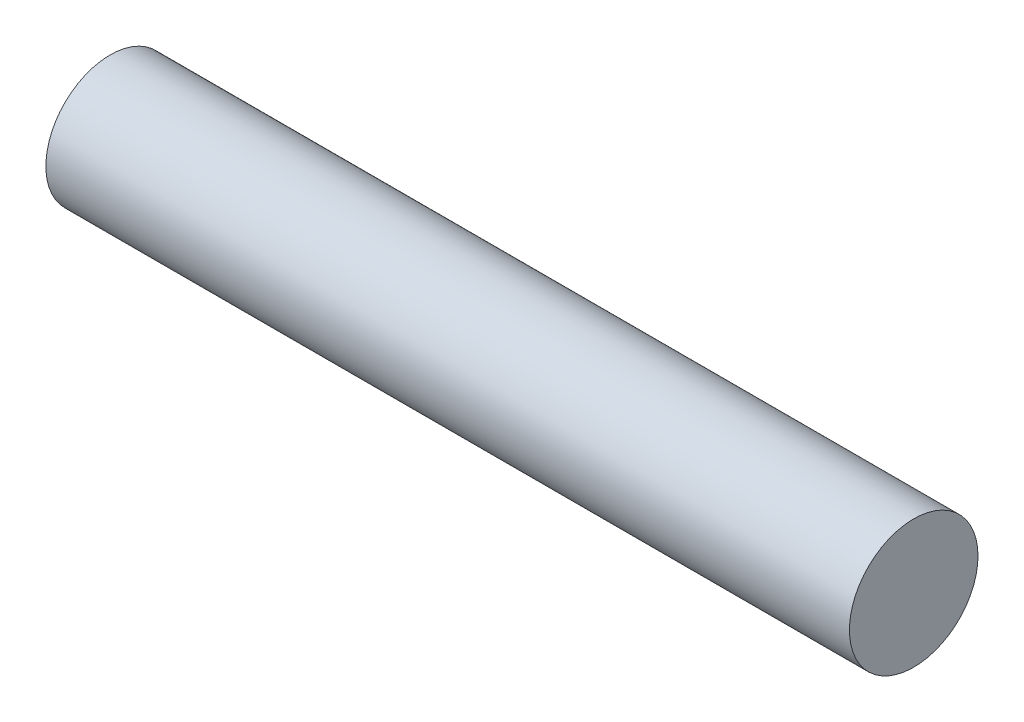
ISO-10303-21;
HEADER;
FILE_DESCRIPTION(('STEP AP214'),'2;1');
FILE_NAME('part.step','',(''),(''),'','','');
FILE_SCHEMA(('AUTOMOTIVE_DESIGN { 1 0 10303 214 1 1 1 1 }'));
ENDSEC;
DATA;
#1=APPLICATION_CONTEXT('core data for automotive mechanical design processes');
#2=APPLICATION_PROTOCOL_DEFINITION('international standard','automotive_design',2000,#1);
#3=PRODUCT_CONTEXT('',#1,'mechanical');
#4=PRODUCT('Part','Part','',(#3));
#5=PRODUCT_RELATED_PRODUCT_CATEGORY('part','',(#4));
#6=PRODUCT_DEFINITION_FORMATION('','',#4);
#7=PRODUCT_DEFINITION_CONTEXT('part definition',#1,'design');
#8=PRODUCT_DEFINITION('design','',#6,#7);
#9=PRODUCT_DEFINITION_SHAPE('','',#8);
#10=(LENGTH_UNIT() NAMED_UNIT(*) SI_UNIT(.MILLI.,.METRE.));
#11=(NAMED_UNIT(*) PLANE_ANGLE_UNIT() SI_UNIT($,.RADIAN.));
#12=(NAMED_UNIT(*) SI_UNIT($,.STERADIAN.) SOLID_ANGLE_UNIT());
#13=UNCERTAINTY_MEASURE_WITH_UNIT(LENGTH_MEASURE(1.E-05),#10,'distance_accuracy_value','');
#14=(GEOMETRIC_REPRESENTATION_CONTEXT(3) GLOBAL_UNCERTAINTY_ASSIGNED_CONTEXT((#13)) GLOBAL_UNIT_ASSIGNED_CONTEXT((#10,
#11,#12)) REPRESENTATION_CONTEXT('',''));
#15=CARTESIAN_POINT('',(0.,0.,0.));
#16=DIRECTION('',(0.,0.,1.));
#17=DIRECTION('',(1.,0.,0.));
#18=AXIS2_PLACEMENT_3D('',#15,#16,#17);
#19=CARTESIAN_POINT('',(-251.,30.,16.));
#20=DIRECTION('',(1.,0.,0.));
#21=DIRECTION('',(0.,0.,-1.));
#22=AXIS2_PLACEMENT_3D('',#19,#20,#21);
#23=PLANE('',#22);
#24=DIRECTION('',(0.,0.,1.));
#25=VECTOR('',#24,1.);
#26=CARTESIAN_POINT('',(-251.,13.,16.));
#27=LINE('',#26,#25);
#28=CARTESIAN_POINT('',(-251.,13.,-16.));
#29=VERTEX_POINT('',#28);
#30=CARTESIAN_POINT('',(-251.,13.,16.));
#31=VERTEX_POINT('',#30);
#32=EDGE_CURVE('E119',#29,#31,#27,.T.);
#33=ORIENTED_EDGE('',*,*,#32,.T.);
#34=DIRECTION('',(0.,-1.,0.));
#35=VECTOR('',#34,1.);
#36=CARTESIAN_POINT('',(-251.,30.,16.));
#37=LINE('',#36,#35);
#38=CARTESIAN_POINT('',(-251.,30.,16.));
#39=VERTEX_POINT('',#38);
#40=EDGE_CURVE('E12',#39,#31,#37,.T.);
#41=ORIENTED_EDGE('',*,*,#40,.F.);
#42=DIRECTION('',(0.,0.,1.));
#43=VECTOR('',#42,1.);
#44=CARTESIAN_POINT('',(-251.,30.,16.));
#45=LINE('',#44,#43);
#46=CARTESIAN_POINT('',(-251.,30.,-16.));
#47=VERTEX_POINT('',#46);
#48=EDGE_CURVE('E107',#47,#39,#45,.T.);
#49=ORIENTED_EDGE('',*,*,#48,.F.);
#50=DIRECTION('',(0.,-1.,0.));
#51=VECTOR('',#50,1.);
#52=CARTESIAN_POINT('',(-251.,30.,-16.));
#53=LINE('',#52,#51);
#54=EDGE_CURVE('E115',#47,#29,#53,.T.);
#55=ORIENTED_EDGE('',*,*,#54,.T.);
#56=EDGE_LOOP('',(#33,#41,#49,#55));
#57=FACE_BOUND('',#56,.T.);
#58=ADVANCED_FACE('F56',(#57),#23,.F.);
#59=CARTESIAN_POINT('',(-251.,30.,16.));
#60=DIRECTION('',(0.,0.,-1.));
#61=DIRECTION('',(-1.,0.,0.));
#62=AXIS2_PLACEMENT_3D('',#59,#60,#61);
#63=PLANE('',#62);
#64=DIRECTION('',(1.,0.,0.));
#65=VECTOR('',#64,1.);
#66=CARTESIAN_POINT('',(-251.,13.,16.));
#67=LINE('',#66,#65);
#68=CARTESIAN_POINT('',(-199.,13.,16.));
#69=VERTEX_POINT('',#68);
#70=EDGE_CURVE('E111',#31,#69,#67,.T.);
#71=ORIENTED_EDGE('',*,*,#70,.T.);
#72=DIRECTION('',(0.,-1.,0.));
#73=VECTOR('',#72,1.);
#74=CARTESIAN_POINT('',(-199.,30.,16.));
#75=LINE('',#74,#73);
#76=CARTESIAN_POINT('',(-199.,30.,16.));
#77=VERTEX_POINT('',#76);
#78=EDGE_CURVE('E64',#77,#69,#75,.T.);
#79=ORIENTED_EDGE('',*,*,#78,.F.);
#80=DIRECTION('',(1.,0.,0.));
#81=VECTOR('',#80,1.);
#82=CARTESIAN_POINT('',(-251.,30.,16.));
#83=LINE('',#82,#81);
#84=EDGE_CURVE('E102',#39,#77,#83,.T.);
#85=ORIENTED_EDGE('',*,*,#84,.F.);
#86=ORIENTED_EDGE('',*,*,#40,.T.);
#87=EDGE_LOOP('',(#71,#79,#85,#86));
#88=FACE_BOUND('',#87,.T.);
#89=ADVANCED_FACE('F110',(#88),#63,.F.);
#90=CARTESIAN_POINT('',(-199.,30.,16.));
#91=DIRECTION('',(-1.,0.,0.));
#92=DIRECTION('',(0.,0.,1.));
#93=AXIS2_PLACEMENT_3D('',#90,#91,#92);
#94=PLANE('',#93);
#95=DIRECTION('',(0.,0.,-1.));
#96=VECTOR('',#95,1.);
#97=CARTESIAN_POINT('',(-199.,13.,16.));
#98=LINE('',#97,#96);
#99=CARTESIAN_POINT('',(-199.,13.,-16.));
#100=VERTEX_POINT('',#99);
#101=EDGE_CURVE('E89',#69,#100,#98,.T.);
#102=ORIENTED_EDGE('',*,*,#101,.T.);
#103=DIRECTION('',(0.,-1.,0.));
#104=VECTOR('',#103,1.);
#105=CARTESIAN_POINT('',(-199.,30.,-16.));
#106=LINE('',#105,#104);
#107=CARTESIAN_POINT('',(-199.,30.,-16.));
#108=VERTEX_POINT('',#107);
#109=EDGE_CURVE('E112',#108,#100,#106,.T.);
#110=ORIENTED_EDGE('',*,*,#109,.F.);
#111=DIRECTION('',(0.,0.,-1.));
#112=VECTOR('',#111,1.);
#113=CARTESIAN_POINT('',(-199.,30.,16.));
#114=LINE('',#113,#112);
#115=EDGE_CURVE('E105',#77,#108,#114,.T.);
#116=ORIENTED_EDGE('',*,*,#115,.F.);
#117=ORIENTED_EDGE('',*,*,#78,.T.);
#118=EDGE_LOOP('',(#102,#110,#116,#117));
#119=FACE_BOUND('',#118,.T.);
#120=ADVANCED_FACE('F113',(#119),#94,.F.);
#121=CARTESIAN_POINT('',(-251.,30.,-16.));
#122=DIRECTION('',(0.,0.,1.));
#123=DIRECTION('',(1.,0.,0.));
#124=AXIS2_PLACEMENT_3D('',#121,#122,#123);
#125=PLANE('',#124);
#126=DIRECTION('',(-1.,0.,0.));
#127=VECTOR('',#126,1.);
#128=CARTESIAN_POINT('',(-251.,13.,-16.));
#129=LINE('',#128,#127);
#130=EDGE_CURVE('E95',#100,#29,#129,.T.);
#131=ORIENTED_EDGE('',*,*,#130,.T.);
#132=ORIENTED_EDGE('',*,*,#54,.F.);
#133=DIRECTION('',(-1.,0.,0.));
#134=VECTOR('',#133,1.);
#135=CARTESIAN_POINT('',(-251.,30.,-16.));
#136=LINE('',#135,#134);
#137=EDGE_CURVE('E72',#108,#47,#136,.T.);
#138=ORIENTED_EDGE('',*,*,#137,.F.);
#139=ORIENTED_EDGE('',*,*,#109,.T.);
#140=EDGE_LOOP('',(#131,#132,#138,#139));
#141=FACE_BOUND('',#140,.T.);
#142=ADVANCED_FACE('F126',(#141),#125,.F.);
#143=CARTESIAN_POINT('',(0.,30.,0.));
#144=DIRECTION('',(0.,-1.,0.));
#145=DIRECTION('',(0.,0.,-1.));
#146=AXIS2_PLACEMENT_3D('',#143,#144,#145);
#147=PLANE('',#146);
#148=ORIENTED_EDGE('',*,*,#48,.T.);
#149=ORIENTED_EDGE('',*,*,#84,.T.);
#150=ORIENTED_EDGE('',*,*,#115,.T.);
#151=ORIENTED_EDGE('',*,*,#137,.T.);
#152=EDGE_LOOP('',(#148,#149,#150,#151));
#153=FACE_BOUND('',#152,.T.);
#154=ADVANCED_FACE('F103',(#153),#147,.F.);
#155=CARTESIAN_POINT('',(0.,13.,0.));
#156=DIRECTION('',(0.,-1.,0.));
#157=DIRECTION('',(0.,0.,-1.));
#158=AXIS2_PLACEMENT_3D('',#155,#156,#157);
#159=PLANE('',#158);
#160=ORIENTED_EDGE('',*,*,#32,.F.);
#161=ORIENTED_EDGE('',*,*,#130,.F.);
#162=ORIENTED_EDGE('',*,*,#101,.F.);
#163=ORIENTED_EDGE('',*,*,#70,.F.);
#164=EDGE_LOOP('',(#160,#161,#162,#163));
#165=FACE_BOUND('',#164,.T.);
#166=ADVANCED_FACE('F129',(#165),#159,.T.);
#167=CLOSED_SHELL('',(#58,#89,#120,#142,#154,#166));
#168=MANIFOLD_SOLID_BREP('B2',#167);
#169=CARTESIAN_POINT('',(-422.5,-47.,24.));
#170=DIRECTION('',(-1.,0.,0.));
#171=DIRECTION('',(0.,0.,1.));
#172=AXIS2_PLACEMENT_3D('',#169,#170,#171);
#173=PLANE('',#172);
#174=DIRECTION('',(0.,1.,0.));
#175=VECTOR('',#174,1.);
#176=CARTESIAN_POINT('',(-422.5,-47.,24.));
#177=LINE('',#176,#175);
#178=CARTESIAN_POINT('',(-422.5,-47.,24.));
#179=VERTEX_POINT('',#178);
#180=CARTESIAN_POINT('',(-422.5,3.,24.));
#181=VERTEX_POINT('',#180);
#182=EDGE_CURVE('E197',#179,#181,#177,.T.);
#183=ORIENTED_EDGE('',*,*,#182,.T.);
#184=DIRECTION('',(0.,0.,1.));
#185=VECTOR('',#184,1.);
#186=CARTESIAN_POINT('',(-422.5,3.,24.));
#187=LINE('',#186,#185);
#188=CARTESIAN_POINT('',(-422.5,3.,-24.));
#189=VERTEX_POINT('',#188);
#190=EDGE_CURVE('E234',#189,#181,#187,.T.);
#191=ORIENTED_EDGE('',*,*,#190,.F.);
#192=DIRECTION('',(0.,1.,0.));
#193=VECTOR('',#192,1.);
#194=CARTESIAN_POINT('',(-422.5,-47.,-24.));
#195=LINE('',#194,#193);
#196=CARTESIAN_POINT('',(-422.5,-47.,-24.));
#197=VERTEX_POINT('',#196);
#198=EDGE_CURVE('E54',#197,#189,#195,.T.);
#199=ORIENTED_EDGE('',*,*,#198,.F.);
#200=DIRECTION('',(0.,0.,1.));
#201=VECTOR('',#200,1.);
#202=CARTESIAN_POINT('',(-422.5,-47.,24.));
#203=LINE('',#202,#201);
#204=EDGE_CURVE('E235',#197,#179,#203,.T.);
#205=ORIENTED_EDGE('',*,*,#204,.T.);
#206=EDGE_LOOP('',(#183,#191,#199,#205));
#207=FACE_BOUND('',#206,.T.);
#208=ADVANCED_FACE('F194',(#207),#173,.T.);
#209=CARTESIAN_POINT('',(-422.5,-47.,-24.));
#210=DIRECTION('',(0.,0.,-1.));
#211=DIRECTION('',(-1.,0.,0.));
#212=AXIS2_PLACEMENT_3D('',#209,#210,#211);
#213=PLANE('',#212);
#214=ORIENTED_EDGE('',*,*,#198,.T.);
#215=DIRECTION('',(-1.,0.,0.));
#216=VECTOR('',#215,1.);
#217=CARTESIAN_POINT('',(-422.5,3.,-24.));
#218=LINE('',#217,#216);
#219=CARTESIAN_POINT('',(-267.5,3.,-24.));
#220=VERTEX_POINT('',#219);
#221=EDGE_CURVE('E251',#220,#189,#218,.T.);
#222=ORIENTED_EDGE('',*,*,#221,.F.);
#223=DIRECTION('',(0.,1.,0.));
#224=VECTOR('',#223,1.);
#225=CARTESIAN_POINT('',(-267.5,-47.,-24.));
#226=LINE('',#225,#224);
#227=CARTESIAN_POINT('',(-267.5,-47.,-24.));
#228=VERTEX_POINT('',#227);
#229=EDGE_CURVE('E202',#228,#220,#226,.T.);
#230=ORIENTED_EDGE('',*,*,#229,.F.);
#231=DIRECTION('',(-1.,0.,0.));
#232=VECTOR('',#231,1.);
#233=CARTESIAN_POINT('',(-422.5,-47.,-24.));
#234=LINE('',#233,#232);
#235=EDGE_CURVE('E240',#228,#197,#234,.T.);
#236=ORIENTED_EDGE('',*,*,#235,.T.);
#237=EDGE_LOOP('',(#214,#222,#230,#236));
#238=FACE_BOUND('',#237,.T.);
#239=ADVANCED_FACE('F266',(#238),#213,.T.);
#240=CARTESIAN_POINT('',(-267.5,-47.,24.));
#241=DIRECTION('',(1.,0.,0.));
#242=DIRECTION('',(0.,0.,-1.));
#243=AXIS2_PLACEMENT_3D('',#240,#241,#242);
#244=PLANE('',#243);
#245=ORIENTED_EDGE('',*,*,#229,.T.);
#246=DIRECTION('',(0.,0.,-1.));
#247=VECTOR('',#246,1.);
#248=CARTESIAN_POINT('',(-267.5,3.,24.));
#249=LINE('',#248,#247);
#250=CARTESIAN_POINT('',(-267.5,3.,24.));
#251=VERTEX_POINT('',#250);
#252=EDGE_CURVE('E247',#251,#220,#249,.T.);
#253=ORIENTED_EDGE('',*,*,#252,.F.);
#254=DIRECTION('',(0.,1.,0.));
#255=VECTOR('',#254,1.);
#256=CARTESIAN_POINT('',(-267.5,-47.,24.));
#257=LINE('',#256,#255);
#258=CARTESIAN_POINT('',(-267.5,-47.,24.));
#259=VERTEX_POINT('',#258);
#260=EDGE_CURVE('E239',#259,#251,#257,.T.);
#261=ORIENTED_EDGE('',*,*,#260,.F.);
#262=DIRECTION('',(0.,0.,-1.));
#263=VECTOR('',#262,1.);
#264=CARTESIAN_POINT('',(-267.5,-47.,24.));
#265=LINE('',#264,#263);
#266=EDGE_CURVE('E259',#259,#228,#265,.T.);
#267=ORIENTED_EDGE('',*,*,#266,.T.);
#268=EDGE_LOOP('',(#245,#253,#261,#267));
#269=FACE_BOUND('',#268,.T.);
#270=ADVANCED_FACE('F263',(#269),#244,.T.);
#271=CARTESIAN_POINT('',(-422.5,-47.,24.));
#272=DIRECTION('',(0.,0.,1.));
#273=DIRECTION('',(1.,0.,0.));
#274=AXIS2_PLACEMENT_3D('',#271,#272,#273);
#275=PLANE('',#274);
#276=ORIENTED_EDGE('',*,*,#260,.T.);
#277=DIRECTION('',(1.,0.,0.));
#278=VECTOR('',#277,1.);
#279=CARTESIAN_POINT('',(-422.5,3.,24.));
#280=LINE('',#279,#278);
#281=EDGE_CURVE('E242',#181,#251,#280,.T.);
#282=ORIENTED_EDGE('',*,*,#281,.F.);
#283=ORIENTED_EDGE('',*,*,#182,.F.);
#284=DIRECTION('',(1.,0.,0.));
#285=VECTOR('',#284,1.);
#286=CARTESIAN_POINT('',(-422.5,-47.,24.));
#287=LINE('',#286,#285);
#288=EDGE_CURVE('E257',#179,#259,#287,.T.);
#289=ORIENTED_EDGE('',*,*,#288,.T.);
#290=EDGE_LOOP('',(#276,#282,#283,#289));
#291=FACE_BOUND('',#290,.T.);
#292=ADVANCED_FACE('F243',(#291),#275,.T.);
#293=CARTESIAN_POINT('',(0.,-47.,0.));
#294=DIRECTION('',(0.,-1.,0.));
#295=DIRECTION('',(0.,0.,-1.));
#296=AXIS2_PLACEMENT_3D('',#293,#294,#295);
#297=PLANE('',#296);
#298=ORIENTED_EDGE('',*,*,#204,.F.);
#299=ORIENTED_EDGE('',*,*,#235,.F.);
#300=ORIENTED_EDGE('',*,*,#266,.F.);
#301=ORIENTED_EDGE('',*,*,#288,.F.);
#302=EDGE_LOOP('',(#298,#299,#300,#301));
#303=FACE_BOUND('',#302,.T.);
#304=ADVANCED_FACE('F268',(#303),#297,.T.);
#305=CARTESIAN_POINT('',(0.,3.,0.));
#306=DIRECTION('',(0.,-1.,0.));
#307=DIRECTION('',(0.,0.,-1.));
#308=AXIS2_PLACEMENT_3D('',#305,#306,#307);
#309=PLANE('',#308);
#310=ORIENTED_EDGE('',*,*,#190,.T.);
#311=ORIENTED_EDGE('',*,*,#281,.T.);
#312=ORIENTED_EDGE('',*,*,#252,.T.);
#313=ORIENTED_EDGE('',*,*,#221,.T.);
#314=EDGE_LOOP('',(#310,#311,#312,#313));
#315=FACE_BOUND('',#314,.T.);
#316=ADVANCED_FACE('F250',(#315),#309,.F.);
#317=CLOSED_SHELL('',(#208,#239,#270,#292,#304,#316));
#318=MANIFOLD_SOLID_BREP('B6',#317);
#319=CARTESIAN_POINT('',(-1000.,0.,0.));
#320=DIRECTION('',(1.,0.,0.));
#321=DIRECTION('',(0.,0.,-1.));
#322=AXIS2_PLACEMENT_3D('',#319,#320,#321);
#323=CYLINDRICAL_SURFACE('',#322,80.);
#324=CARTESIAN_POINT('',(-1000.,0.,0.));
#325=DIRECTION('',(1.,0.,0.));
#326=DIRECTION('',(0.,0.,-1.));
#327=AXIS2_PLACEMENT_3D('',#324,#325,#326);
#328=CIRCLE('',#327,80.);
#329=CARTESIAN_POINT('',(-1000.,0.,-80.));
#330=VERTEX_POINT('',#329);
#331=EDGE_CURVE('E332',#330,#330,#328,.T.);
#332=ORIENTED_EDGE('',*,*,#331,.T.);
#333=EDGE_LOOP('',(#332));
#334=FACE_BOUND('',#333,.T.);
#335=CARTESIAN_POINT('',(0.,0.,0.));
#336=DIRECTION('',(1.,0.,0.));
#337=DIRECTION('',(0.,0.,-1.));
#338=AXIS2_PLACEMENT_3D('',#335,#336,#337);
#339=CIRCLE('',#338,80.);
#340=CARTESIAN_POINT('',(0.,0.,-80.));
#341=VERTEX_POINT('',#340);
#342=EDGE_CURVE('E327',#341,#341,#339,.T.);
#343=ORIENTED_EDGE('',*,*,#342,.F.);
#344=EDGE_LOOP('',(#343));
#345=FACE_BOUND('',#344,.T.);
#346=ADVANCED_FACE('F324',(#334,#345),#323,.T.);
#347=CARTESIAN_POINT('',(-1000.,0.,0.));
#348=DIRECTION('',(1.,0.,0.));
#349=DIRECTION('',(0.,0.,-1.));
#350=AXIS2_PLACEMENT_3D('',#347,#348,#349);
#351=PLANE('',#350);
#352=ORIENTED_EDGE('',*,*,#331,.F.);
#353=EDGE_LOOP('',(#352));
#354=FACE_BOUND('',#353,.T.);
#355=ADVANCED_FACE('F472',(#354),#351,.F.);
#356=CARTESIAN_POINT('',(0.,0.,0.));
#357=DIRECTION('',(1.,0.,0.));
#358=DIRECTION('',(0.,0.,-1.));
#359=AXIS2_PLACEMENT_3D('',#356,#357,#358);
#360=PLANE('',#359);
#361=ORIENTED_EDGE('',*,*,#342,.T.);
#362=EDGE_LOOP('',(#361));
#363=FACE_BOUND('',#362,.T.);
#364=ADVANCED_FACE('F469',(#363),#360,.T.);
#365=CLOSED_SHELL('',(#346,#355,#364));
#366=CARTESIAN_POINT('',(0.,9.99999999999999,0.));
#367=DIRECTION('',(0.,-1.,0.));
#368=DIRECTION('',(0.,0.,-1.));
#369=AXIS2_PLACEMENT_3D('',#366,#367,#368);
#370=PLANE('',#369);
#371=DIRECTION('',(-1.,0.,0.));
#372=VECTOR('',#371,1.);
#373=CARTESIAN_POINT('',(-427.5,9.99999999999999,-30.));
#374=LINE('',#373,#372);
#375=CARTESIAN_POINT('',(-300.,10.,-30.));
#376=VERTEX_POINT('',#375);
#377=CARTESIAN_POINT('',(-427.5,9.99999999999999,-30.));
#378=VERTEX_POINT('',#377);
#379=EDGE_CURVE('E364',#376,#378,#374,.T.);
#380=ORIENTED_EDGE('',*,*,#379,.F.);
#381=DIRECTION('',(0.,0.,1.));
#382=VECTOR('',#381,1.);
#383=CARTESIAN_POINT('',(-300.,10.,40.));
#384=LINE('',#383,#382);
#385=CARTESIAN_POINT('',(-300.,9.99999999999999,30.));
#386=VERTEX_POINT('',#385);
#387=EDGE_CURVE('E192',#376,#386,#384,.T.);
#388=ORIENTED_EDGE('',*,*,#387,.T.);
#389=DIRECTION('',(1.,0.,0.));
#390=VECTOR('',#389,1.);
#391=CARTESIAN_POINT('',(-427.5,9.99999999999999,30.));
#392=LINE('',#391,#390);
#393=CARTESIAN_POINT('',(-427.5,9.99999999999999,30.));
#394=VERTEX_POINT('',#393);
#395=EDGE_CURVE('E449',#394,#386,#392,.T.);
#396=ORIENTED_EDGE('',*,*,#395,.F.);
#397=DIRECTION('',(0.,0.,1.));
#398=VECTOR('',#397,1.);
#399=CARTESIAN_POINT('',(-427.5,9.99999999999999,30.));
#400=LINE('',#399,#398);
#401=EDGE_CURVE('E427',#378,#394,#400,.T.);
#402=ORIENTED_EDGE('',*,*,#401,.F.);
#403=EDGE_LOOP('',(#380,#388,#396,#402));
#404=FACE_BOUND('',#403,.T.);
#405=ADVANCED_FACE('F484',(#404),#370,.T.);
#406=CARTESIAN_POINT('',(-427.5,-50.,30.));
#407=DIRECTION('',(-1.,0.,0.));
#408=DIRECTION('',(0.,0.,1.));
#409=AXIS2_PLACEMENT_3D('',#406,#407,#408);
#410=PLANE('',#409);
#411=ORIENTED_EDGE('',*,*,#401,.T.);
#412=DIRECTION('',(0.,1.,0.));
#413=VECTOR('',#412,1.);
#414=CARTESIAN_POINT('',(-427.5,-50.,30.));
#415=LINE('',#414,#413);
#416=CARTESIAN_POINT('',(-427.5,-50.,30.));
#417=VERTEX_POINT('',#416);
#418=EDGE_CURVE('E369',#417,#394,#415,.T.);
#419=ORIENTED_EDGE('',*,*,#418,.F.);
#420=DIRECTION('',(0.,0.,1.));
#421=VECTOR('',#420,1.);
#422=CARTESIAN_POINT('',(-427.5,-50.,30.));
#423=LINE('',#422,#421);
#424=CARTESIAN_POINT('',(-427.5,-50.,-30.));
#425=VERTEX_POINT('',#424);
#426=EDGE_CURVE('E436',#425,#417,#423,.T.);
#427=ORIENTED_EDGE('',*,*,#426,.F.);
#428=DIRECTION('',(0.,1.,0.));
#429=VECTOR('',#428,1.);
#430=CARTESIAN_POINT('',(-427.5,-50.,-30.));
#431=LINE('',#430,#429);
#432=EDGE_CURVE('E350',#425,#378,#431,.T.);
#433=ORIENTED_EDGE('',*,*,#432,.T.);
#434=EDGE_LOOP('',(#411,#419,#427,#433));
#435=FACE_BOUND('',#434,.T.);
#436=ADVANCED_FACE('F480',(#435),#410,.F.);
#437=CARTESIAN_POINT('',(-427.5,-50.,-30.));
#438=DIRECTION('',(0.,0.,-1.));
#439=DIRECTION('',(-1.,0.,0.));
#440=AXIS2_PLACEMENT_3D('',#437,#438,#439);
#441=PLANE('',#440);
#442=CARTESIAN_POINT('',(-262.5,9.99999999999999,-30.));
#443=VERTEX_POINT('',#442);
#444=EDGE_CURVE('E440',#443,#376,#374,.T.);
#445=ORIENTED_EDGE('',*,*,#444,.T.);
#446=ORIENTED_EDGE('',*,*,#379,.T.);
#447=ORIENTED_EDGE('',*,*,#432,.F.);
#448=DIRECTION('',(-1.,0.,0.));
#449=VECTOR('',#448,1.);
#450=CARTESIAN_POINT('',(-427.5,-50.,-30.));
#451=LINE('',#450,#449);
#452=CARTESIAN_POINT('',(-262.5,-50.,-30.));
#453=VERTEX_POINT('',#452);
#454=EDGE_CURVE('E446',#453,#425,#451,.T.);
#455=ORIENTED_EDGE('',*,*,#454,.F.);
#456=DIRECTION('',(0.,1.,0.));
#457=VECTOR('',#456,1.);
#458=CARTESIAN_POINT('',(-262.5,-50.,-30.));
#459=LINE('',#458,#457);
#460=EDGE_CURVE('E457',#453,#443,#459,.T.);
#461=ORIENTED_EDGE('',*,*,#460,.T.);
#462=EDGE_LOOP('',(#445,#446,#447,#455,#461));
#463=FACE_BOUND('',#462,.T.);
#464=ADVANCED_FACE('F483',(#463),#441,.F.);
#465=CARTESIAN_POINT('',(-262.5,-50.,30.));
#466=DIRECTION('',(1.,0.,0.));
#467=DIRECTION('',(0.,0.,-1.));
#468=AXIS2_PLACEMENT_3D('',#465,#466,#467);
#469=PLANE('',#468);
#470=DIRECTION('',(0.,0.,-1.));
#471=VECTOR('',#470,1.);
#472=CARTESIAN_POINT('',(-262.5,9.99999999999999,30.));
#473=LINE('',#472,#471);
#474=CARTESIAN_POINT('',(-262.5,9.99999999999999,30.));
#475=VERTEX_POINT('',#474);
#476=EDGE_CURVE('E452',#475,#443,#473,.T.);
#477=ORIENTED_EDGE('',*,*,#476,.T.);
#478=ORIENTED_EDGE('',*,*,#460,.F.);
#479=DIRECTION('',(0.,0.,-1.));
#480=VECTOR('',#479,1.);
#481=CARTESIAN_POINT('',(-262.5,-50.,30.));
#482=LINE('',#481,#480);
#483=CARTESIAN_POINT('',(-262.5,-50.,30.));
#484=VERTEX_POINT('',#483);
#485=EDGE_CURVE('E443',#484,#453,#482,.T.);
#486=ORIENTED_EDGE('',*,*,#485,.F.);
#487=DIRECTION('',(0.,1.,0.));
#488=VECTOR('',#487,1.);
#489=CARTESIAN_POINT('',(-262.5,-50.,30.));
#490=LINE('',#489,#488);
#491=EDGE_CURVE('E460',#484,#475,#490,.T.);
#492=ORIENTED_EDGE('',*,*,#491,.T.);
#493=EDGE_LOOP('',(#477,#478,#486,#492));
#494=FACE_BOUND('',#493,.T.);
#495=ADVANCED_FACE('F490',(#494),#469,.F.);
#496=CARTESIAN_POINT('',(-427.5,-50.,30.));
#497=DIRECTION('',(0.,0.,1.));
#498=DIRECTION('',(1.,0.,0.));
#499=AXIS2_PLACEMENT_3D('',#496,#497,#498);
#500=PLANE('',#499);
#501=ORIENTED_EDGE('',*,*,#395,.T.);
#502=EDGE_CURVE('E430',#386,#475,#392,.T.);
#503=ORIENTED_EDGE('',*,*,#502,.T.);
#504=ORIENTED_EDGE('',*,*,#491,.F.);
#505=DIRECTION('',(1.,0.,0.));
#506=VECTOR('',#505,1.);
#507=CARTESIAN_POINT('',(-427.5,-50.,30.));
#508=LINE('',#507,#506);
#509=EDGE_CURVE('E439',#417,#484,#508,.T.);
#510=ORIENTED_EDGE('',*,*,#509,.F.);
#511=ORIENTED_EDGE('',*,*,#418,.T.);
#512=EDGE_LOOP('',(#501,#503,#504,#510,#511));
#513=FACE_BOUND('',#512,.T.);
#514=ADVANCED_FACE('F486',(#513),#500,.F.);
#515=CARTESIAN_POINT('',(0.,-50.,0.));
#516=DIRECTION('',(0.,-1.,0.));
#517=DIRECTION('',(0.,0.,-1.));
#518=AXIS2_PLACEMENT_3D('',#515,#516,#517);
#519=PLANE('',#518);
#520=ORIENTED_EDGE('',*,*,#426,.T.);
#521=ORIENTED_EDGE('',*,*,#509,.T.);
#522=ORIENTED_EDGE('',*,*,#485,.T.);
#523=ORIENTED_EDGE('',*,*,#454,.T.);
#524=EDGE_LOOP('',(#520,#521,#522,#523));
#525=FACE_BOUND('',#524,.T.);
#526=ADVANCED_FACE('F489',(#525),#519,.F.);
#527=CARTESIAN_POINT('',(0.,10.,0.));
#528=DIRECTION('',(0.,-1.,0.));
#529=DIRECTION('',(0.,0.,-1.));
#530=AXIS2_PLACEMENT_3D('',#527,#528,#529);
#531=PLANE('',#530);
#532=ORIENTED_EDGE('',*,*,#476,.F.);
#533=ORIENTED_EDGE('',*,*,#502,.F.);
#534=CARTESIAN_POINT('',(-300.,10.,40.));
#535=VERTEX_POINT('',#534);
#536=EDGE_CURVE('E335',#386,#535,#384,.T.);
#537=ORIENTED_EDGE('',*,*,#536,.T.);
#538=DIRECTION('',(1.,0.,0.));
#539=VECTOR('',#538,1.);
#540=CARTESIAN_POINT('',(-300.,10.,40.));
#541=LINE('',#540,#539);
#542=CARTESIAN_POINT('',(-150.,10.,40.));
#543=VERTEX_POINT('',#542);
#544=EDGE_CURVE('E426',#535,#543,#541,.T.);
#545=ORIENTED_EDGE('',*,*,#544,.T.);
#546=DIRECTION('',(0.,0.,-1.));
#547=VECTOR('',#546,1.);
#548=CARTESIAN_POINT('',(-150.,10.,40.));
#549=LINE('',#548,#547);
#550=CARTESIAN_POINT('',(-150.,10.,-40.));
#551=VERTEX_POINT('',#550);
#552=EDGE_CURVE('E630',#543,#551,#549,.T.);
#553=ORIENTED_EDGE('',*,*,#552,.T.);
#554=DIRECTION('',(-1.,0.,0.));
#555=VECTOR('',#554,1.);
#556=CARTESIAN_POINT('',(-300.,10.,-40.));
#557=LINE('',#556,#555);
#558=CARTESIAN_POINT('',(-300.,10.,-40.));
#559=VERTEX_POINT('',#558);
#560=EDGE_CURVE('E422',#551,#559,#557,.T.);
#561=ORIENTED_EDGE('',*,*,#560,.T.);
#562=EDGE_CURVE('E334',#559,#376,#384,.T.);
#563=ORIENTED_EDGE('',*,*,#562,.T.);
#564=ORIENTED_EDGE('',*,*,#444,.F.);
#565=EDGE_LOOP('',(#532,#533,#537,#545,#553,#561,#563,#564));
#566=FACE_BOUND('',#565,.T.);
#567=ADVANCED_FACE('F502',(#566),#531,.F.);
#568=CARTESIAN_POINT('',(-300.,45.,40.));
#569=DIRECTION('',(1.,0.,0.));
#570=DIRECTION('',(0.,0.,-1.));
#571=AXIS2_PLACEMENT_3D('',#568,#569,#570);
#572=PLANE('',#571);
#573=ORIENTED_EDGE('',*,*,#562,.F.);
#574=DIRECTION('',(0.,-1.,0.));
#575=VECTOR('',#574,1.);
#576=CARTESIAN_POINT('',(-300.,45.,-40.));
#577=LINE('',#576,#575);
#578=CARTESIAN_POINT('',(-300.,45.,-40.));
#579=VERTEX_POINT('',#578);
#580=EDGE_CURVE('E421',#579,#559,#577,.T.);
#581=ORIENTED_EDGE('',*,*,#580,.F.);
#582=DIRECTION('',(0.,0.,1.));
#583=VECTOR('',#582,1.);
#584=CARTESIAN_POINT('',(-300.,45.,40.));
#585=LINE('',#584,#583);
#586=CARTESIAN_POINT('',(-300.,45.,40.));
#587=VERTEX_POINT('',#586);
#588=EDGE_CURVE('E409',#579,#587,#585,.T.);
#589=ORIENTED_EDGE('',*,*,#588,.T.);
#590=DIRECTION('',(0.,-1.,0.));
#591=VECTOR('',#590,1.);
#592=CARTESIAN_POINT('',(-300.,45.,40.));
#593=LINE('',#592,#591);
#594=EDGE_CURVE('E419',#587,#535,#593,.T.);
#595=ORIENTED_EDGE('',*,*,#594,.T.);
#596=ORIENTED_EDGE('',*,*,#536,.F.);
#597=ORIENTED_EDGE('',*,*,#387,.F.);
#598=EDGE_LOOP('',(#573,#581,#589,#595,#596,#597));
#599=FACE_BOUND('',#598,.T.);
#600=ADVANCED_FACE('F418',(#599),#572,.T.);
#601=CARTESIAN_POINT('',(-300.,45.,40.));
#602=DIRECTION('',(0.,0.,-1.));
#603=DIRECTION('',(-1.,0.,0.));
#604=AXIS2_PLACEMENT_3D('',#601,#602,#603);
#605=PLANE('',#604);
#606=ORIENTED_EDGE('',*,*,#544,.F.);
#607=ORIENTED_EDGE('',*,*,#594,.F.);
#608=DIRECTION('',(1.,0.,0.));
#609=VECTOR('',#608,1.);
#610=CARTESIAN_POINT('',(-300.,45.,40.));
#611=LINE('',#610,#609);
#612=CARTESIAN_POINT('',(-150.,45.,40.));
#613=VERTEX_POINT('',#612);
#614=EDGE_CURVE('E405',#587,#613,#611,.T.);
#615=ORIENTED_EDGE('',*,*,#614,.T.);
#616=DIRECTION('',(0.,-1.,0.));
#617=VECTOR('',#616,1.);
#618=CARTESIAN_POINT('',(-150.,45.,40.));
#619=LINE('',#618,#617);
#620=EDGE_CURVE('E428',#613,#543,#619,.T.);
#621=ORIENTED_EDGE('',*,*,#620,.T.);
#622=EDGE_LOOP('',(#606,#607,#615,#621));
#623=FACE_BOUND('',#622,.T.);
#624=ADVANCED_FACE('F425',(#623),#605,.T.);
#625=CARTESIAN_POINT('',(-150.,45.,40.));
#626=DIRECTION('',(-1.,0.,0.));
#627=DIRECTION('',(0.,0.,1.));
#628=AXIS2_PLACEMENT_3D('',#625,#626,#627);
#629=PLANE('',#628);
#630=ORIENTED_EDGE('',*,*,#552,.F.);
#631=ORIENTED_EDGE('',*,*,#620,.F.);
#632=DIRECTION('',(0.,0.,-1.));
#633=VECTOR('',#632,1.);
#634=CARTESIAN_POINT('',(-150.,45.,40.));
#635=LINE('',#634,#633);
#636=CARTESIAN_POINT('',(-150.,45.,-40.));
#637=VERTEX_POINT('',#636);
#638=EDGE_CURVE('E410',#613,#637,#635,.T.);
#639=ORIENTED_EDGE('',*,*,#638,.T.);
#640=DIRECTION('',(0.,-1.,0.));
#641=VECTOR('',#640,1.);
#642=CARTESIAN_POINT('',(-150.,45.,-40.));
#643=LINE('',#642,#641);
#644=EDGE_CURVE('E432',#637,#551,#643,.T.);
#645=ORIENTED_EDGE('',*,*,#644,.T.);
#646=EDGE_LOOP('',(#630,#631,#639,#645));
#647=FACE_BOUND('',#646,.T.);
#648=ADVANCED_FACE('F508',(#647),#629,.T.);
#649=CARTESIAN_POINT('',(-300.,45.,-40.));
#650=DIRECTION('',(0.,0.,1.));
#651=DIRECTION('',(1.,0.,0.));
#652=AXIS2_PLACEMENT_3D('',#649,#650,#651);
#653=PLANE('',#652);
#654=ORIENTED_EDGE('',*,*,#560,.F.);
#655=ORIENTED_EDGE('',*,*,#644,.F.);
#656=DIRECTION('',(-1.,0.,0.));
#657=VECTOR('',#656,1.);
#658=CARTESIAN_POINT('',(-300.,45.,-40.));
#659=LINE('',#658,#657);
#660=EDGE_CURVE('E633',#637,#579,#659,.T.);
#661=ORIENTED_EDGE('',*,*,#660,.T.);
#662=ORIENTED_EDGE('',*,*,#580,.T.);
#663=EDGE_LOOP('',(#654,#655,#661,#662));
#664=FACE_BOUND('',#663,.T.);
#665=ADVANCED_FACE('F511',(#664),#653,.T.);
#666=CARTESIAN_POINT('',(0.,45.,0.));
#667=DIRECTION('',(0.,-1.,0.));
#668=DIRECTION('',(0.,0.,-1.));
#669=AXIS2_PLACEMENT_3D('',#666,#667,#668);
#670=PLANE('',#669);
#671=ORIENTED_EDGE('',*,*,#588,.F.);
#672=ORIENTED_EDGE('',*,*,#660,.F.);
#673=ORIENTED_EDGE('',*,*,#638,.F.);
#674=ORIENTED_EDGE('',*,*,#614,.F.);
#675=EDGE_LOOP('',(#671,#672,#673,#674));
#676=FACE_BOUND('',#675,.T.);
#677=ADVANCED_FACE('F407',(#676),#670,.T.);
#678=CLOSED_SHELL('',(#405,#436,#464,#495,#514,#526,#567,#600,#624,#648,#665,#677));
#679=ORIENTED_CLOSED_SHELL('',*,#365,.T.);
#680=BREP_WITH_VOIDS('B48',#678,(#679));
#681=ADVANCED_BREP_SHAPE_REPRESENTATION('',(#18,#168,#318,#680),#14);
#682=SHAPE_DEFINITION_REPRESENTATION(#9,#681);
ENDSEC;
END-ISO-10303-21;
